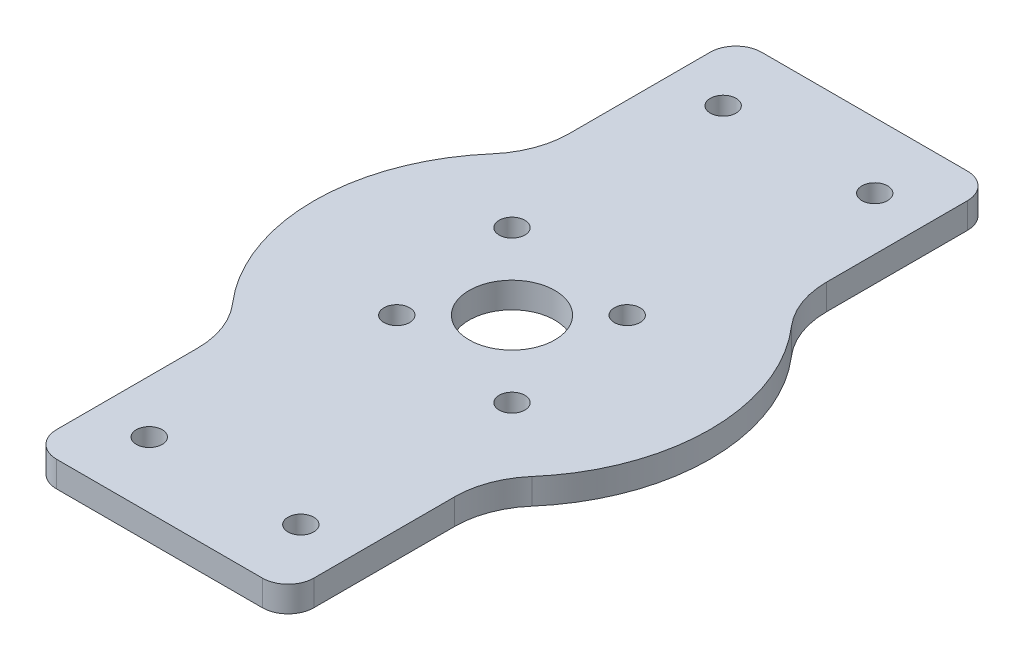
ISO-10303-21;
HEADER;
FILE_DESCRIPTION(('STEP AP214'),'2;1');
FILE_NAME('part.step','',(''),(''),'','','');
FILE_SCHEMA(('AUTOMOTIVE_DESIGN { 1 0 10303 214 1 1 1 1 }'));
ENDSEC;
DATA;
#1=APPLICATION_CONTEXT('core data for automotive mechanical design processes');
#2=APPLICATION_PROTOCOL_DEFINITION('international standard','automotive_design',2000,#1);
#3=PRODUCT_CONTEXT('',#1,'mechanical');
#4=PRODUCT('Part','Part','',(#3));
#5=PRODUCT_RELATED_PRODUCT_CATEGORY('part','',(#4));
#6=PRODUCT_DEFINITION_FORMATION('','',#4);
#7=PRODUCT_DEFINITION_CONTEXT('part definition',#1,'design');
#8=PRODUCT_DEFINITION('design','',#6,#7);
#9=PRODUCT_DEFINITION_SHAPE('','',#8);
#10=(LENGTH_UNIT() NAMED_UNIT(*) SI_UNIT(.MILLI.,.METRE.));
#11=(NAMED_UNIT(*) PLANE_ANGLE_UNIT() SI_UNIT($,.RADIAN.));
#12=(NAMED_UNIT(*) SI_UNIT($,.STERADIAN.) SOLID_ANGLE_UNIT());
#13=UNCERTAINTY_MEASURE_WITH_UNIT(LENGTH_MEASURE(1.E-05),#10,'distance_accuracy_value','');
#14=(GEOMETRIC_REPRESENTATION_CONTEXT(3) GLOBAL_UNCERTAINTY_ASSIGNED_CONTEXT((#13)) GLOBAL_UNIT_ASSIGNED_CONTEXT((#10,
#11,#12)) REPRESENTATION_CONTEXT('',''));
#15=CARTESIAN_POINT('',(0.,0.,0.));
#16=DIRECTION('',(0.,0.,1.));
#17=DIRECTION('',(1.,0.,0.));
#18=AXIS2_PLACEMENT_3D('',#15,#16,#17);
#19=CARTESIAN_POINT('',(25.,3.,21.6935474277491));
#20=DIRECTION('',(0.,-1.,0.));
#21=DIRECTION('',(0.,0.,-1.));
#22=AXIS2_PLACEMENT_3D('',#19,#20,#21);
#23=PLANE('',#22);
#24=CARTESIAN_POINT('',(25.,3.,21.6935474277491));
#25=DIRECTION('',(0.,-1.,0.));
#26=DIRECTION('',(0.,0.,-1.));
#27=AXIS2_PLACEMENT_3D('',#24,#25,#26);
#28=CIRCLE('',#27,10.);
#29=CARTESIAN_POINT('',(15.,3.,21.6935474277491));
#30=VERTEX_POINT('',#29);
#31=CARTESIAN_POINT('',(17.4471299093656,3.,15.1396056066769));
#32=VERTEX_POINT('',#31);
#33=EDGE_CURVE('E208',#30,#32,#28,.T.);
#34=ORIENTED_EDGE('',*,*,#33,.T.);
#35=CARTESIAN_POINT('',(0.,3.,0.));
#36=DIRECTION('',(0.,1.,0.));
#37=DIRECTION('',(0.,0.,-1.));
#38=AXIS2_PLACEMENT_3D('',#35,#36,#37);
#39=CIRCLE('',#38,23.1);
#40=CARTESIAN_POINT('',(17.4471299093656,3.,-15.1396056066769));
#41=VERTEX_POINT('',#40);
#42=EDGE_CURVE('E116',#32,#41,#39,.T.);
#43=ORIENTED_EDGE('',*,*,#42,.T.);
#44=CARTESIAN_POINT('',(25.,3.,-21.6935474277491));
#45=DIRECTION('',(0.,-1.,0.));
#46=DIRECTION('',(0.,0.,1.));
#47=AXIS2_PLACEMENT_3D('',#44,#45,#46);
#48=CIRCLE('',#47,10.);
#49=CARTESIAN_POINT('',(15.,3.,-21.6935474277491));
#50=VERTEX_POINT('',#49);
#51=EDGE_CURVE('E247',#41,#50,#48,.T.);
#52=ORIENTED_EDGE('',*,*,#51,.T.);
#53=DIRECTION('',(0.,0.,-1.));
#54=VECTOR('',#53,1.);
#55=CARTESIAN_POINT('',(15.,3.,-38.1080164681499));
#56=LINE('',#55,#54);
#57=CARTESIAN_POINT('',(15.,3.,-38.1080164681499));
#58=VERTEX_POINT('',#57);
#59=EDGE_CURVE('E266',#50,#58,#56,.T.);
#60=ORIENTED_EDGE('',*,*,#59,.T.);
#61=CARTESIAN_POINT('',(12.,3.,-38.10801646815));
#62=DIRECTION('',(0.,1.,0.));
#63=DIRECTION('',(0.,0.,-1.));
#64=AXIS2_PLACEMENT_3D('',#61,#62,#63);
#65=CIRCLE('',#64,3.);
#66=CARTESIAN_POINT('',(12.,3.,-41.10801646815));
#67=VERTEX_POINT('',#66);
#68=EDGE_CURVE('E263',#58,#67,#65,.T.);
#69=ORIENTED_EDGE('',*,*,#68,.T.);
#70=DIRECTION('',(-1.,0.,0.));
#71=VECTOR('',#70,1.);
#72=CARTESIAN_POINT('',(-12.,3.,-41.10801646815));
#73=LINE('',#72,#71);
#74=CARTESIAN_POINT('',(-12.,3.,-41.10801646815));
#75=VERTEX_POINT('',#74);
#76=EDGE_CURVE('E265',#67,#75,#73,.T.);
#77=ORIENTED_EDGE('',*,*,#76,.T.);
#78=CARTESIAN_POINT('',(-12.,3.,-38.10801646815));
#79=DIRECTION('',(0.,1.,0.));
#80=DIRECTION('',(0.,0.,-1.));
#81=AXIS2_PLACEMENT_3D('',#78,#79,#80);
#82=CIRCLE('',#81,3.);
#83=CARTESIAN_POINT('',(-15.,3.,-38.1080164681499));
#84=VERTEX_POINT('',#83);
#85=EDGE_CURVE('E268',#75,#84,#82,.T.);
#86=ORIENTED_EDGE('',*,*,#85,.T.);
#87=DIRECTION('',(0.,0.,1.));
#88=VECTOR('',#87,1.);
#89=CARTESIAN_POINT('',(-15.,3.,-21.6935474277491));
#90=LINE('',#89,#88);
#91=CARTESIAN_POINT('',(-15.,3.,-21.6935474277491));
#92=VERTEX_POINT('',#91);
#93=EDGE_CURVE('E274',#84,#92,#90,.T.);
#94=ORIENTED_EDGE('',*,*,#93,.T.);
#95=CARTESIAN_POINT('',(-25.,3.,-21.6935474277491));
#96=DIRECTION('',(0.,-1.,0.));
#97=DIRECTION('',(0.,0.,1.));
#98=AXIS2_PLACEMENT_3D('',#95,#96,#97);
#99=CIRCLE('',#98,10.);
#100=CARTESIAN_POINT('',(-17.4471299093656,3.,-15.1396056066769));
#101=VERTEX_POINT('',#100);
#102=EDGE_CURVE('E276',#92,#101,#99,.T.);
#103=ORIENTED_EDGE('',*,*,#102,.T.);
#104=CARTESIAN_POINT('',(0.,3.,0.));
#105=DIRECTION('',(0.,1.,0.));
#106=DIRECTION('',(0.,0.,1.));
#107=AXIS2_PLACEMENT_3D('',#104,#105,#106);
#108=CIRCLE('',#107,23.1);
#109=CARTESIAN_POINT('',(-17.4471299093656,3.,15.1396056066769));
#110=VERTEX_POINT('',#109);
#111=EDGE_CURVE('E278',#101,#110,#108,.T.);
#112=ORIENTED_EDGE('',*,*,#111,.T.);
#113=CARTESIAN_POINT('',(-25.,3.,21.6935474277491));
#114=DIRECTION('',(0.,-1.,0.));
#115=DIRECTION('',(0.,0.,1.));
#116=AXIS2_PLACEMENT_3D('',#113,#114,#115);
#117=CIRCLE('',#116,10.);
#118=CARTESIAN_POINT('',(-15.,3.,21.6935474277491));
#119=VERTEX_POINT('',#118);
#120=EDGE_CURVE('E280',#110,#119,#117,.T.);
#121=ORIENTED_EDGE('',*,*,#120,.T.);
#122=DIRECTION('',(0.,0.,1.));
#123=VECTOR('',#122,1.);
#124=CARTESIAN_POINT('',(-15.,3.,21.6935474277491));
#125=LINE('',#124,#123);
#126=CARTESIAN_POINT('',(-15.,3.,38.1080164681499));
#127=VERTEX_POINT('',#126);
#128=EDGE_CURVE('E282',#119,#127,#125,.T.);
#129=ORIENTED_EDGE('',*,*,#128,.T.);
#130=CARTESIAN_POINT('',(-12.,3.,38.10801646815));
#131=DIRECTION('',(0.,1.,0.));
#132=DIRECTION('',(0.,0.,1.));
#133=AXIS2_PLACEMENT_3D('',#130,#131,#132);
#134=CIRCLE('',#133,3.);
#135=CARTESIAN_POINT('',(-12.,3.,41.10801646815));
#136=VERTEX_POINT('',#135);
#137=EDGE_CURVE('E159',#127,#136,#134,.T.);
#138=ORIENTED_EDGE('',*,*,#137,.T.);
#139=DIRECTION('',(1.,0.,0.));
#140=VECTOR('',#139,1.);
#141=CARTESIAN_POINT('',(-12.,3.,41.10801646815));
#142=LINE('',#141,#140);
#143=CARTESIAN_POINT('',(12.,3.,41.10801646815));
#144=VERTEX_POINT('',#143);
#145=EDGE_CURVE('E153',#136,#144,#142,.T.);
#146=ORIENTED_EDGE('',*,*,#145,.T.);
#147=CARTESIAN_POINT('',(12.,3.,38.10801646815));
#148=DIRECTION('',(0.,1.,0.));
#149=DIRECTION('',(0.,0.,1.));
#150=AXIS2_PLACEMENT_3D('',#147,#148,#149);
#151=CIRCLE('',#150,3.);
#152=CARTESIAN_POINT('',(15.,3.,38.1080164681499));
#153=VERTEX_POINT('',#152);
#154=EDGE_CURVE('E157',#144,#153,#151,.T.);
#155=ORIENTED_EDGE('',*,*,#154,.T.);
#156=DIRECTION('',(0.,0.,-1.));
#157=VECTOR('',#156,1.);
#158=CARTESIAN_POINT('',(15.,3.,38.1080164681499));
#159=LINE('',#158,#157);
#160=EDGE_CURVE('E49',#153,#30,#159,.T.);
#161=ORIENTED_EDGE('',*,*,#160,.T.);
#162=EDGE_LOOP('',(#34,#43,#52,#60,#69,#77,#86,#94,#103,#112,#121,#129,#138,#146,#155,#161));
#163=FACE_BOUND('',#162,.T.);
#164=CARTESIAN_POINT('',(-8.83883476483185,3.,-8.83883476483185));
#165=DIRECTION('',(0.,1.,0.));
#166=DIRECTION('',(0.,0.,1.));
#167=AXIS2_PLACEMENT_3D('',#164,#165,#166);
#168=CIRCLE('',#167,1.5);
#169=CARTESIAN_POINT('',(-8.83883476483185,3.,-7.33883476483185));
#170=VERTEX_POINT('',#169);
#171=EDGE_CURVE('E181',#170,#170,#168,.T.);
#172=ORIENTED_EDGE('',*,*,#171,.F.);
#173=EDGE_LOOP('',(#172));
#174=FACE_BOUND('',#173,.T.);
#175=CARTESIAN_POINT('',(8.83883476483185,3.,8.83883476483184));
#176=DIRECTION('',(0.,1.,0.));
#177=DIRECTION('',(0.,0.,-1.));
#178=AXIS2_PLACEMENT_3D('',#175,#176,#177);
#179=CIRCLE('',#178,1.5);
#180=CARTESIAN_POINT('',(8.83883476483185,3.,7.33883476483184));
#181=VERTEX_POINT('',#180);
#182=EDGE_CURVE('E396',#181,#181,#179,.T.);
#183=ORIENTED_EDGE('',*,*,#182,.F.);
#184=EDGE_LOOP('',(#183));
#185=FACE_BOUND('',#184,.T.);
#186=CARTESIAN_POINT('',(6.7175144212722,3.,-6.7175144212722));
#187=DIRECTION('',(0.,1.,0.));
#188=DIRECTION('',(0.,0.,1.));
#189=AXIS2_PLACEMENT_3D('',#186,#187,#188);
#190=CIRCLE('',#189,1.5);
#191=CARTESIAN_POINT('',(6.7175144212722,3.,-5.2175144212722));
#192=VERTEX_POINT('',#191);
#193=EDGE_CURVE('E390',#192,#192,#190,.T.);
#194=ORIENTED_EDGE('',*,*,#193,.F.);
#195=EDGE_LOOP('',(#194));
#196=FACE_BOUND('',#195,.T.);
#197=CARTESIAN_POINT('',(-6.7175144212722,3.,6.71751442127221));
#198=DIRECTION('',(0.,1.,0.));
#199=DIRECTION('',(0.,0.,-1.));
#200=AXIS2_PLACEMENT_3D('',#197,#198,#199);
#201=CIRCLE('',#200,1.50000000000001);
#202=CARTESIAN_POINT('',(-6.7175144212722,3.,5.2175144212722));
#203=VERTEX_POINT('',#202);
#204=EDGE_CURVE('E384',#203,#203,#201,.T.);
#205=ORIENTED_EDGE('',*,*,#204,.F.);
#206=EDGE_LOOP('',(#205));
#207=FACE_BOUND('',#206,.T.);
#208=CARTESIAN_POINT('',(0.,3.,0.));
#209=DIRECTION('',(0.,1.,0.));
#210=DIRECTION('',(0.,0.,1.));
#211=AXIS2_PLACEMENT_3D('',#208,#209,#210);
#212=CIRCLE('',#211,5.);
#213=CARTESIAN_POINT('',(0.,3.,5.));
#214=VERTEX_POINT('',#213);
#215=EDGE_CURVE('E378',#214,#214,#212,.T.);
#216=ORIENTED_EDGE('',*,*,#215,.F.);
#217=EDGE_LOOP('',(#216));
#218=FACE_BOUND('',#217,.T.);
#219=CARTESIAN_POINT('',(-8.83883476483185,3.,-33.4627924380176));
#220=DIRECTION('',(0.,1.,0.));
#221=DIRECTION('',(0.,0.,1.));
#222=AXIS2_PLACEMENT_3D('',#219,#220,#221);
#223=CIRCLE('',#222,1.5);
#224=CARTESIAN_POINT('',(-8.83883476483185,3.,-31.9627924380176));
#225=VERTEX_POINT('',#224);
#226=EDGE_CURVE('E372',#225,#225,#223,.T.);
#227=ORIENTED_EDGE('',*,*,#226,.F.);
#228=EDGE_LOOP('',(#227));
#229=FACE_BOUND('',#228,.T.);
#230=CARTESIAN_POINT('',(8.83883476483185,3.,-33.4627924380176));
#231=DIRECTION('',(0.,1.,0.));
#232=DIRECTION('',(0.,0.,-1.));
#233=AXIS2_PLACEMENT_3D('',#230,#231,#232);
#234=CIRCLE('',#233,1.5);
#235=CARTESIAN_POINT('',(8.83883476483185,3.,-34.9627924380176));
#236=VERTEX_POINT('',#235);
#237=EDGE_CURVE('E366',#236,#236,#234,.T.);
#238=ORIENTED_EDGE('',*,*,#237,.F.);
#239=EDGE_LOOP('',(#238));
#240=FACE_BOUND('',#239,.T.);
#241=CARTESIAN_POINT('',(8.83883476483185,3.,33.4627924380176));
#242=DIRECTION('',(0.,1.,0.));
#243=DIRECTION('',(0.,0.,1.));
#244=AXIS2_PLACEMENT_3D('',#241,#242,#243);
#245=CIRCLE('',#244,1.5);
#246=CARTESIAN_POINT('',(8.83883476483185,3.,34.9627924380176));
#247=VERTEX_POINT('',#246);
#248=EDGE_CURVE('E360',#247,#247,#245,.T.);
#249=ORIENTED_EDGE('',*,*,#248,.F.);
#250=EDGE_LOOP('',(#249));
#251=FACE_BOUND('',#250,.T.);
#252=CARTESIAN_POINT('',(-8.83883476483185,3.,33.4627924380176));
#253=DIRECTION('',(0.,1.,0.));
#254=DIRECTION('',(0.,0.,-1.));
#255=AXIS2_PLACEMENT_3D('',#252,#253,#254);
#256=CIRCLE('',#255,1.5);
#257=CARTESIAN_POINT('',(-8.83883476483185,3.,31.9627924380176));
#258=VERTEX_POINT('',#257);
#259=EDGE_CURVE('E351',#258,#258,#256,.T.);
#260=ORIENTED_EDGE('',*,*,#259,.F.);
#261=EDGE_LOOP('',(#260));
#262=FACE_BOUND('',#261,.T.);
#263=ADVANCED_FACE('F32',(#163,#174,#185,#196,#207,#218,#229,#240,#251,#262),#23,.F.);
#264=CARTESIAN_POINT('',(25.,0.,21.6935474277491));
#265=DIRECTION('',(0.,-1.,0.));
#266=DIRECTION('',(0.,0.,-1.));
#267=AXIS2_PLACEMENT_3D('',#264,#265,#266);
#268=PLANE('',#267);
#269=CARTESIAN_POINT('',(8.83883476483185,0.,33.4627924380176));
#270=DIRECTION('',(0.,1.,0.));
#271=DIRECTION('',(0.,0.,1.));
#272=AXIS2_PLACEMENT_3D('',#269,#270,#271);
#273=CIRCLE('',#272,1.5);
#274=CARTESIAN_POINT('',(8.83883476483185,0.,34.9627924380176));
#275=VERTEX_POINT('',#274);
#276=EDGE_CURVE('E357',#275,#275,#273,.T.);
#277=ORIENTED_EDGE('',*,*,#276,.T.);
#278=EDGE_LOOP('',(#277));
#279=FACE_BOUND('',#278,.T.);
#280=CARTESIAN_POINT('',(-8.83883476483185,0.,-33.4627924380176));
#281=DIRECTION('',(0.,1.,0.));
#282=DIRECTION('',(0.,0.,1.));
#283=AXIS2_PLACEMENT_3D('',#280,#281,#282);
#284=CIRCLE('',#283,1.5);
#285=CARTESIAN_POINT('',(-8.83883476483185,0.,-31.9627924380176));
#286=VERTEX_POINT('',#285);
#287=EDGE_CURVE('E369',#286,#286,#284,.T.);
#288=ORIENTED_EDGE('',*,*,#287,.T.);
#289=EDGE_LOOP('',(#288));
#290=FACE_BOUND('',#289,.T.);
#291=CARTESIAN_POINT('',(-6.7175144212722,0.,6.71751442127221));
#292=DIRECTION('',(0.,1.,0.));
#293=DIRECTION('',(0.,0.,-1.));
#294=AXIS2_PLACEMENT_3D('',#291,#292,#293);
#295=CIRCLE('',#294,1.50000000000001);
#296=CARTESIAN_POINT('',(-6.7175144212722,0.,5.2175144212722));
#297=VERTEX_POINT('',#296);
#298=EDGE_CURVE('E381',#297,#297,#295,.T.);
#299=ORIENTED_EDGE('',*,*,#298,.T.);
#300=EDGE_LOOP('',(#299));
#301=FACE_BOUND('',#300,.T.);
#302=CARTESIAN_POINT('',(8.83883476483185,0.,8.83883476483184));
#303=DIRECTION('',(0.,1.,0.));
#304=DIRECTION('',(0.,0.,-1.));
#305=AXIS2_PLACEMENT_3D('',#302,#303,#304);
#306=CIRCLE('',#305,1.5);
#307=CARTESIAN_POINT('',(8.83883476483185,0.,7.33883476483184));
#308=VERTEX_POINT('',#307);
#309=EDGE_CURVE('E393',#308,#308,#306,.T.);
#310=ORIENTED_EDGE('',*,*,#309,.T.);
#311=EDGE_LOOP('',(#310));
#312=FACE_BOUND('',#311,.T.);
#313=CARTESIAN_POINT('',(25.,0.,21.6935474277491));
#314=DIRECTION('',(0.,-1.,0.));
#315=DIRECTION('',(0.,0.,-1.));
#316=AXIS2_PLACEMENT_3D('',#313,#314,#315);
#317=CIRCLE('',#316,10.);
#318=CARTESIAN_POINT('',(15.,0.,21.6935474277491));
#319=VERTEX_POINT('',#318);
#320=CARTESIAN_POINT('',(17.4471299093656,0.,15.1396056066769));
#321=VERTEX_POINT('',#320);
#322=EDGE_CURVE('E177',#319,#321,#317,.T.);
#323=ORIENTED_EDGE('',*,*,#322,.F.);
#324=DIRECTION('',(0.,0.,-1.));
#325=VECTOR('',#324,1.);
#326=CARTESIAN_POINT('',(15.,0.,38.1080164681499));
#327=LINE('',#326,#325);
#328=CARTESIAN_POINT('',(15.,0.,38.1080164681499));
#329=VERTEX_POINT('',#328);
#330=EDGE_CURVE('E108',#329,#319,#327,.T.);
#331=ORIENTED_EDGE('',*,*,#330,.F.);
#332=CARTESIAN_POINT('',(12.,0.,38.10801646815));
#333=DIRECTION('',(0.,1.,0.));
#334=DIRECTION('',(0.,0.,1.));
#335=AXIS2_PLACEMENT_3D('',#332,#333,#334);
#336=CIRCLE('',#335,3.);
#337=CARTESIAN_POINT('',(12.,0.,41.10801646815));
#338=VERTEX_POINT('',#337);
#339=EDGE_CURVE('E102',#338,#329,#336,.T.);
#340=ORIENTED_EDGE('',*,*,#339,.F.);
#341=DIRECTION('',(1.,0.,0.));
#342=VECTOR('',#341,1.);
#343=CARTESIAN_POINT('',(-12.,0.,41.10801646815));
#344=LINE('',#343,#342);
#345=CARTESIAN_POINT('',(-12.,0.,41.10801646815));
#346=VERTEX_POINT('',#345);
#347=EDGE_CURVE('E167',#346,#338,#344,.T.);
#348=ORIENTED_EDGE('',*,*,#347,.F.);
#349=CARTESIAN_POINT('',(-12.,0.,38.10801646815));
#350=DIRECTION('',(0.,1.,0.));
#351=DIRECTION('',(0.,0.,1.));
#352=AXIS2_PLACEMENT_3D('',#349,#350,#351);
#353=CIRCLE('',#352,3.);
#354=CARTESIAN_POINT('',(-15.,0.,38.1080164681499));
#355=VERTEX_POINT('',#354);
#356=EDGE_CURVE('E203',#355,#346,#353,.T.);
#357=ORIENTED_EDGE('',*,*,#356,.F.);
#358=DIRECTION('',(0.,0.,1.));
#359=VECTOR('',#358,1.);
#360=CARTESIAN_POINT('',(-15.,0.,21.6935474277491));
#361=LINE('',#360,#359);
#362=CARTESIAN_POINT('',(-15.,0.,21.6935474277491));
#363=VERTEX_POINT('',#362);
#364=EDGE_CURVE('E201',#363,#355,#361,.T.);
#365=ORIENTED_EDGE('',*,*,#364,.F.);
#366=CARTESIAN_POINT('',(-25.,0.,21.6935474277491));
#367=DIRECTION('',(0.,-1.,0.));
#368=DIRECTION('',(0.,0.,1.));
#369=AXIS2_PLACEMENT_3D('',#366,#367,#368);
#370=CIRCLE('',#369,10.);
#371=CARTESIAN_POINT('',(-17.4471299093656,0.,15.1396056066769));
#372=VERTEX_POINT('',#371);
#373=EDGE_CURVE('E199',#372,#363,#370,.T.);
#374=ORIENTED_EDGE('',*,*,#373,.F.);
#375=CARTESIAN_POINT('',(0.,0.,0.));
#376=DIRECTION('',(0.,1.,0.));
#377=DIRECTION('',(0.,0.,1.));
#378=AXIS2_PLACEMENT_3D('',#375,#376,#377);
#379=CIRCLE('',#378,23.1);
#380=CARTESIAN_POINT('',(-17.4471299093656,0.,-15.1396056066769));
#381=VERTEX_POINT('',#380);
#382=EDGE_CURVE('E197',#381,#372,#379,.T.);
#383=ORIENTED_EDGE('',*,*,#382,.F.);
#384=CARTESIAN_POINT('',(-25.,0.,-21.6935474277491));
#385=DIRECTION('',(0.,-1.,0.));
#386=DIRECTION('',(0.,0.,1.));
#387=AXIS2_PLACEMENT_3D('',#384,#385,#386);
#388=CIRCLE('',#387,10.);
#389=CARTESIAN_POINT('',(-15.,0.,-21.6935474277491));
#390=VERTEX_POINT('',#389);
#391=EDGE_CURVE('E195',#390,#381,#388,.T.);
#392=ORIENTED_EDGE('',*,*,#391,.F.);
#393=DIRECTION('',(0.,0.,1.));
#394=VECTOR('',#393,1.);
#395=CARTESIAN_POINT('',(-15.,0.,-21.6935474277491));
#396=LINE('',#395,#394);
#397=CARTESIAN_POINT('',(-15.,0.,-38.1080164681499));
#398=VERTEX_POINT('',#397);
#399=EDGE_CURVE('E193',#398,#390,#396,.T.);
#400=ORIENTED_EDGE('',*,*,#399,.F.);
#401=CARTESIAN_POINT('',(-12.,0.,-38.10801646815));
#402=DIRECTION('',(0.,1.,0.));
#403=DIRECTION('',(0.,0.,-1.));
#404=AXIS2_PLACEMENT_3D('',#401,#402,#403);
#405=CIRCLE('',#404,3.);
#406=CARTESIAN_POINT('',(-12.,0.,-41.10801646815));
#407=VERTEX_POINT('',#406);
#408=EDGE_CURVE('E191',#407,#398,#405,.T.);
#409=ORIENTED_EDGE('',*,*,#408,.F.);
#410=DIRECTION('',(-1.,0.,0.));
#411=VECTOR('',#410,1.);
#412=CARTESIAN_POINT('',(-12.,0.,-41.10801646815));
#413=LINE('',#412,#411);
#414=CARTESIAN_POINT('',(12.,0.,-41.10801646815));
#415=VERTEX_POINT('',#414);
#416=EDGE_CURVE('E189',#415,#407,#413,.T.);
#417=ORIENTED_EDGE('',*,*,#416,.F.);
#418=CARTESIAN_POINT('',(12.,0.,-38.10801646815));
#419=DIRECTION('',(0.,1.,0.));
#420=DIRECTION('',(0.,0.,-1.));
#421=AXIS2_PLACEMENT_3D('',#418,#419,#420);
#422=CIRCLE('',#421,3.);
#423=CARTESIAN_POINT('',(15.,0.,-38.1080164681499));
#424=VERTEX_POINT('',#423);
#425=EDGE_CURVE('E187',#424,#415,#422,.T.);
#426=ORIENTED_EDGE('',*,*,#425,.F.);
#427=DIRECTION('',(0.,0.,-1.));
#428=VECTOR('',#427,1.);
#429=CARTESIAN_POINT('',(15.,0.,-38.1080164681499));
#430=LINE('',#429,#428);
#431=CARTESIAN_POINT('',(15.,0.,-21.6935474277491));
#432=VERTEX_POINT('',#431);
#433=EDGE_CURVE('E185',#432,#424,#430,.T.);
#434=ORIENTED_EDGE('',*,*,#433,.F.);
#435=CARTESIAN_POINT('',(25.,0.,-21.6935474277491));
#436=DIRECTION('',(0.,-1.,0.));
#437=DIRECTION('',(0.,0.,1.));
#438=AXIS2_PLACEMENT_3D('',#435,#436,#437);
#439=CIRCLE('',#438,10.);
#440=CARTESIAN_POINT('',(17.4471299093656,0.,-15.1396056066769));
#441=VERTEX_POINT('',#440);
#442=EDGE_CURVE('E183',#441,#432,#439,.T.);
#443=ORIENTED_EDGE('',*,*,#442,.F.);
#444=CARTESIAN_POINT('',(0.,0.,0.));
#445=DIRECTION('',(0.,1.,0.));
#446=DIRECTION('',(0.,0.,-1.));
#447=AXIS2_PLACEMENT_3D('',#444,#445,#446);
#448=CIRCLE('',#447,23.1);
#449=EDGE_CURVE('E180',#321,#441,#448,.T.);
#450=ORIENTED_EDGE('',*,*,#449,.F.);
#451=EDGE_LOOP('',(#323,#331,#340,#348,#357,#365,#374,#383,#392,#400,#409,#417,#426,#434,#443,#450));
#452=FACE_BOUND('',#451,.T.);
#453=CARTESIAN_POINT('',(-8.83883476483185,0.,-8.83883476483185));
#454=DIRECTION('',(0.,1.,0.));
#455=DIRECTION('',(0.,0.,1.));
#456=AXIS2_PLACEMENT_3D('',#453,#454,#455);
#457=CIRCLE('',#456,1.5);
#458=CARTESIAN_POINT('',(-8.83883476483185,0.,-7.33883476483185));
#459=VERTEX_POINT('',#458);
#460=EDGE_CURVE('E399',#459,#459,#457,.T.);
#461=ORIENTED_EDGE('',*,*,#460,.T.);
#462=EDGE_LOOP('',(#461));
#463=FACE_BOUND('',#462,.T.);
#464=CARTESIAN_POINT('',(6.7175144212722,0.,-6.7175144212722));
#465=DIRECTION('',(0.,1.,0.));
#466=DIRECTION('',(0.,0.,1.));
#467=AXIS2_PLACEMENT_3D('',#464,#465,#466);
#468=CIRCLE('',#467,1.5);
#469=CARTESIAN_POINT('',(6.7175144212722,0.,-5.2175144212722));
#470=VERTEX_POINT('',#469);
#471=EDGE_CURVE('E387',#470,#470,#468,.T.);
#472=ORIENTED_EDGE('',*,*,#471,.T.);
#473=EDGE_LOOP('',(#472));
#474=FACE_BOUND('',#473,.T.);
#475=CARTESIAN_POINT('',(0.,0.,0.));
#476=DIRECTION('',(0.,1.,0.));
#477=DIRECTION('',(0.,0.,1.));
#478=AXIS2_PLACEMENT_3D('',#475,#476,#477);
#479=CIRCLE('',#478,5.);
#480=CARTESIAN_POINT('',(0.,0.,5.));
#481=VERTEX_POINT('',#480);
#482=EDGE_CURVE('E375',#481,#481,#479,.T.);
#483=ORIENTED_EDGE('',*,*,#482,.T.);
#484=EDGE_LOOP('',(#483));
#485=FACE_BOUND('',#484,.T.);
#486=CARTESIAN_POINT('',(8.83883476483185,0.,-33.4627924380176));
#487=DIRECTION('',(0.,1.,0.));
#488=DIRECTION('',(0.,0.,-1.));
#489=AXIS2_PLACEMENT_3D('',#486,#487,#488);
#490=CIRCLE('',#489,1.5);
#491=CARTESIAN_POINT('',(8.83883476483185,0.,-34.9627924380176));
#492=VERTEX_POINT('',#491);
#493=EDGE_CURVE('E363',#492,#492,#490,.T.);
#494=ORIENTED_EDGE('',*,*,#493,.T.);
#495=EDGE_LOOP('',(#494));
#496=FACE_BOUND('',#495,.T.);
#497=CARTESIAN_POINT('',(-8.83883476483185,0.,33.4627924380176));
#498=DIRECTION('',(0.,1.,0.));
#499=DIRECTION('',(0.,0.,-1.));
#500=AXIS2_PLACEMENT_3D('',#497,#498,#499);
#501=CIRCLE('',#500,1.5);
#502=CARTESIAN_POINT('',(-8.83883476483185,0.,31.9627924380176));
#503=VERTEX_POINT('',#502);
#504=EDGE_CURVE('E354',#503,#503,#501,.T.);
#505=ORIENTED_EDGE('',*,*,#504,.T.);
#506=EDGE_LOOP('',(#505));
#507=FACE_BOUND('',#506,.T.);
#508=ADVANCED_FACE('F251',(#279,#290,#301,#312,#452,#463,#474,#485,#496,#507),#268,.T.);
#509=CARTESIAN_POINT('',(25.,3.,21.6935474277491));
#510=DIRECTION('',(0.,-1.,0.));
#511=DIRECTION('',(0.,0.,-1.));
#512=AXIS2_PLACEMENT_3D('',#509,#510,#511);
#513=CYLINDRICAL_SURFACE('',#512,10.);
#514=ORIENTED_EDGE('',*,*,#322,.T.);
#515=DIRECTION('',(0.,-1.,0.));
#516=VECTOR('',#515,1.);
#517=CARTESIAN_POINT('',(17.4471299093656,3.,15.1396056066769));
#518=LINE('',#517,#516);
#519=EDGE_CURVE('E11',#32,#321,#518,.T.);
#520=ORIENTED_EDGE('',*,*,#519,.F.);
#521=ORIENTED_EDGE('',*,*,#33,.F.);
#522=DIRECTION('',(0.,-1.,0.));
#523=VECTOR('',#522,1.);
#524=CARTESIAN_POINT('',(15.,3.,21.6935474277491));
#525=LINE('',#524,#523);
#526=EDGE_CURVE('E173',#30,#319,#525,.T.);
#527=ORIENTED_EDGE('',*,*,#526,.T.);
#528=EDGE_LOOP('',(#514,#520,#521,#527));
#529=FACE_BOUND('',#528,.T.);
#530=ADVANCED_FACE('F34',(#529),#513,.F.);
#531=CARTESIAN_POINT('',(0.,3.,0.));
#532=DIRECTION('',(0.,-1.,0.));
#533=DIRECTION('',(0.,0.,-1.));
#534=AXIS2_PLACEMENT_3D('',#531,#532,#533);
#535=CYLINDRICAL_SURFACE('',#534,23.1);
#536=ORIENTED_EDGE('',*,*,#449,.T.);
#537=DIRECTION('',(0.,-1.,0.));
#538=VECTOR('',#537,1.);
#539=CARTESIAN_POINT('',(17.4471299093656,3.,-15.1396056066769));
#540=LINE('',#539,#538);
#541=EDGE_CURVE('E41',#41,#441,#540,.T.);
#542=ORIENTED_EDGE('',*,*,#541,.F.);
#543=ORIENTED_EDGE('',*,*,#42,.F.);
#544=ORIENTED_EDGE('',*,*,#519,.T.);
#545=EDGE_LOOP('',(#536,#542,#543,#544));
#546=FACE_BOUND('',#545,.T.);
#547=ADVANCED_FACE('F596',(#546),#535,.T.);
#548=CARTESIAN_POINT('',(25.,3.,-21.6935474277491));
#549=DIRECTION('',(0.,-1.,0.));
#550=DIRECTION('',(0.,0.,-1.));
#551=AXIS2_PLACEMENT_3D('',#548,#549,#550);
#552=CYLINDRICAL_SURFACE('',#551,10.);
#553=ORIENTED_EDGE('',*,*,#442,.T.);
#554=DIRECTION('',(0.,-1.,0.));
#555=VECTOR('',#554,1.);
#556=CARTESIAN_POINT('',(15.,3.,-21.6935474277491));
#557=LINE('',#556,#555);
#558=EDGE_CURVE('E239',#50,#432,#557,.T.);
#559=ORIENTED_EDGE('',*,*,#558,.F.);
#560=ORIENTED_EDGE('',*,*,#51,.F.);
#561=ORIENTED_EDGE('',*,*,#541,.T.);
#562=EDGE_LOOP('',(#553,#559,#560,#561));
#563=FACE_BOUND('',#562,.T.);
#564=ADVANCED_FACE('F245',(#563),#552,.F.);
#565=CARTESIAN_POINT('',(15.,3.,-38.1080164681499));
#566=DIRECTION('',(-1.,0.,0.));
#567=DIRECTION('',(0.,0.,1.));
#568=AXIS2_PLACEMENT_3D('',#565,#566,#567);
#569=PLANE('',#568);
#570=ORIENTED_EDGE('',*,*,#433,.T.);
#571=DIRECTION('',(0.,-1.,0.));
#572=VECTOR('',#571,1.);
#573=CARTESIAN_POINT('',(15.,3.,-38.1080164681499));
#574=LINE('',#573,#572);
#575=EDGE_CURVE('E236',#58,#424,#574,.T.);
#576=ORIENTED_EDGE('',*,*,#575,.F.);
#577=ORIENTED_EDGE('',*,*,#59,.F.);
#578=ORIENTED_EDGE('',*,*,#558,.T.);
#579=EDGE_LOOP('',(#570,#576,#577,#578));
#580=FACE_BOUND('',#579,.T.);
#581=ADVANCED_FACE('F257',(#580),#569,.F.);
#582=CARTESIAN_POINT('',(12.,3.,-38.10801646815));
#583=DIRECTION('',(0.,-1.,0.));
#584=DIRECTION('',(0.,0.,-1.));
#585=AXIS2_PLACEMENT_3D('',#582,#583,#584);
#586=CYLINDRICAL_SURFACE('',#585,3.);
#587=ORIENTED_EDGE('',*,*,#425,.T.);
#588=DIRECTION('',(0.,-1.,0.));
#589=VECTOR('',#588,1.);
#590=CARTESIAN_POINT('',(12.,3.,-41.10801646815));
#591=LINE('',#590,#589);
#592=EDGE_CURVE('E233',#67,#415,#591,.T.);
#593=ORIENTED_EDGE('',*,*,#592,.F.);
#594=ORIENTED_EDGE('',*,*,#68,.F.);
#595=ORIENTED_EDGE('',*,*,#575,.T.);
#596=EDGE_LOOP('',(#587,#593,#594,#595));
#597=FACE_BOUND('',#596,.T.);
#598=ADVANCED_FACE('F261',(#597),#586,.T.);
#599=CARTESIAN_POINT('',(-12.,3.,-41.10801646815));
#600=DIRECTION('',(0.,0.,1.));
#601=DIRECTION('',(1.,0.,0.));
#602=AXIS2_PLACEMENT_3D('',#599,#600,#601);
#603=PLANE('',#602);
#604=ORIENTED_EDGE('',*,*,#416,.T.);
#605=DIRECTION('',(0.,-1.,0.));
#606=VECTOR('',#605,1.);
#607=CARTESIAN_POINT('',(-12.,3.,-41.10801646815));
#608=LINE('',#607,#606);
#609=EDGE_CURVE('E230',#75,#407,#608,.T.);
#610=ORIENTED_EDGE('',*,*,#609,.F.);
#611=ORIENTED_EDGE('',*,*,#76,.F.);
#612=ORIENTED_EDGE('',*,*,#592,.T.);
#613=EDGE_LOOP('',(#604,#610,#611,#612));
#614=FACE_BOUND('',#613,.T.);
#615=ADVANCED_FACE('F561',(#614),#603,.F.);
#616=CARTESIAN_POINT('',(-12.,3.,-38.10801646815));
#617=DIRECTION('',(0.,-1.,0.));
#618=DIRECTION('',(0.,0.,-1.));
#619=AXIS2_PLACEMENT_3D('',#616,#617,#618);
#620=CYLINDRICAL_SURFACE('',#619,3.);
#621=ORIENTED_EDGE('',*,*,#408,.T.);
#622=DIRECTION('',(0.,-1.,0.));
#623=VECTOR('',#622,1.);
#624=CARTESIAN_POINT('',(-15.,3.,-38.1080164681499));
#625=LINE('',#624,#623);
#626=EDGE_CURVE('E227',#84,#398,#625,.T.);
#627=ORIENTED_EDGE('',*,*,#626,.F.);
#628=ORIENTED_EDGE('',*,*,#85,.F.);
#629=ORIENTED_EDGE('',*,*,#609,.T.);
#630=EDGE_LOOP('',(#621,#627,#628,#629));
#631=FACE_BOUND('',#630,.T.);
#632=ADVANCED_FACE('F551',(#631),#620,.T.);
#633=CARTESIAN_POINT('',(-15.,3.,-21.6935474277491));
#634=DIRECTION('',(1.,0.,0.));
#635=DIRECTION('',(0.,0.,-1.));
#636=AXIS2_PLACEMENT_3D('',#633,#634,#635);
#637=PLANE('',#636);
#638=ORIENTED_EDGE('',*,*,#399,.T.);
#639=DIRECTION('',(0.,-1.,0.));
#640=VECTOR('',#639,1.);
#641=CARTESIAN_POINT('',(-15.,3.,-21.6935474277491));
#642=LINE('',#641,#640);
#643=EDGE_CURVE('E224',#92,#390,#642,.T.);
#644=ORIENTED_EDGE('',*,*,#643,.F.);
#645=ORIENTED_EDGE('',*,*,#93,.F.);
#646=ORIENTED_EDGE('',*,*,#626,.T.);
#647=EDGE_LOOP('',(#638,#644,#645,#646));
#648=FACE_BOUND('',#647,.T.);
#649=ADVANCED_FACE('F541',(#648),#637,.F.);
#650=CARTESIAN_POINT('',(-25.,3.,-21.6935474277491));
#651=DIRECTION('',(0.,-1.,0.));
#652=DIRECTION('',(0.,0.,-1.));
#653=AXIS2_PLACEMENT_3D('',#650,#651,#652);
#654=CYLINDRICAL_SURFACE('',#653,10.);
#655=ORIENTED_EDGE('',*,*,#391,.T.);
#656=DIRECTION('',(0.,-1.,0.));
#657=VECTOR('',#656,1.);
#658=CARTESIAN_POINT('',(-17.4471299093656,3.,-15.1396056066769));
#659=LINE('',#658,#657);
#660=EDGE_CURVE('E221',#101,#381,#659,.T.);
#661=ORIENTED_EDGE('',*,*,#660,.F.);
#662=ORIENTED_EDGE('',*,*,#102,.F.);
#663=ORIENTED_EDGE('',*,*,#643,.T.);
#664=EDGE_LOOP('',(#655,#661,#662,#663));
#665=FACE_BOUND('',#664,.T.);
#666=ADVANCED_FACE('F531',(#665),#654,.F.);
#667=CARTESIAN_POINT('',(0.,3.,0.));
#668=DIRECTION('',(0.,-1.,0.));
#669=DIRECTION('',(0.,0.,-1.));
#670=AXIS2_PLACEMENT_3D('',#667,#668,#669);
#671=CYLINDRICAL_SURFACE('',#670,23.1);
#672=ORIENTED_EDGE('',*,*,#382,.T.);
#673=DIRECTION('',(0.,-1.,0.));
#674=VECTOR('',#673,1.);
#675=CARTESIAN_POINT('',(-17.4471299093656,3.,15.1396056066769));
#676=LINE('',#675,#674);
#677=EDGE_CURVE('E218',#110,#372,#676,.T.);
#678=ORIENTED_EDGE('',*,*,#677,.F.);
#679=ORIENTED_EDGE('',*,*,#111,.F.);
#680=ORIENTED_EDGE('',*,*,#660,.T.);
#681=EDGE_LOOP('',(#672,#678,#679,#680));
#682=FACE_BOUND('',#681,.T.);
#683=ADVANCED_FACE('F521',(#682),#671,.T.);
#684=CARTESIAN_POINT('',(-25.,3.,21.6935474277491));
#685=DIRECTION('',(0.,-1.,0.));
#686=DIRECTION('',(0.,0.,-1.));
#687=AXIS2_PLACEMENT_3D('',#684,#685,#686);
#688=CYLINDRICAL_SURFACE('',#687,10.);
#689=ORIENTED_EDGE('',*,*,#373,.T.);
#690=DIRECTION('',(0.,-1.,0.));
#691=VECTOR('',#690,1.);
#692=CARTESIAN_POINT('',(-15.,3.,21.6935474277491));
#693=LINE('',#692,#691);
#694=EDGE_CURVE('E215',#119,#363,#693,.T.);
#695=ORIENTED_EDGE('',*,*,#694,.F.);
#696=ORIENTED_EDGE('',*,*,#120,.F.);
#697=ORIENTED_EDGE('',*,*,#677,.T.);
#698=EDGE_LOOP('',(#689,#695,#696,#697));
#699=FACE_BOUND('',#698,.T.);
#700=ADVANCED_FACE('F512',(#699),#688,.F.);
#701=CARTESIAN_POINT('',(-15.,3.,21.6935474277491));
#702=DIRECTION('',(1.,0.,0.));
#703=DIRECTION('',(0.,0.,-1.));
#704=AXIS2_PLACEMENT_3D('',#701,#702,#703);
#705=PLANE('',#704);
#706=ORIENTED_EDGE('',*,*,#364,.T.);
#707=DIRECTION('',(0.,-1.,0.));
#708=VECTOR('',#707,1.);
#709=CARTESIAN_POINT('',(-15.,3.,38.1080164681499));
#710=LINE('',#709,#708);
#711=EDGE_CURVE('E212',#127,#355,#710,.T.);
#712=ORIENTED_EDGE('',*,*,#711,.F.);
#713=ORIENTED_EDGE('',*,*,#128,.F.);
#714=ORIENTED_EDGE('',*,*,#694,.T.);
#715=EDGE_LOOP('',(#706,#712,#713,#714));
#716=FACE_BOUND('',#715,.T.);
#717=ADVANCED_FACE('F288',(#716),#705,.F.);
#718=CARTESIAN_POINT('',(-12.,3.,38.10801646815));
#719=DIRECTION('',(0.,-1.,0.));
#720=DIRECTION('',(0.,0.,-1.));
#721=AXIS2_PLACEMENT_3D('',#718,#719,#720);
#722=CYLINDRICAL_SURFACE('',#721,3.);
#723=ORIENTED_EDGE('',*,*,#356,.T.);
#724=DIRECTION('',(0.,-1.,0.));
#725=VECTOR('',#724,1.);
#726=CARTESIAN_POINT('',(-12.,3.,41.10801646815));
#727=LINE('',#726,#725);
#728=EDGE_CURVE('E168',#136,#346,#727,.T.);
#729=ORIENTED_EDGE('',*,*,#728,.F.);
#730=ORIENTED_EDGE('',*,*,#137,.F.);
#731=ORIENTED_EDGE('',*,*,#711,.T.);
#732=EDGE_LOOP('',(#723,#729,#730,#731));
#733=FACE_BOUND('',#732,.T.);
#734=ADVANCED_FACE('F292',(#733),#722,.T.);
#735=CARTESIAN_POINT('',(-12.,3.,41.10801646815));
#736=DIRECTION('',(0.,0.,-1.));
#737=DIRECTION('',(-1.,0.,0.));
#738=AXIS2_PLACEMENT_3D('',#735,#736,#737);
#739=PLANE('',#738);
#740=ORIENTED_EDGE('',*,*,#347,.T.);
#741=DIRECTION('',(0.,-1.,0.));
#742=VECTOR('',#741,1.);
#743=CARTESIAN_POINT('',(12.,3.,41.10801646815));
#744=LINE('',#743,#742);
#745=EDGE_CURVE('E164',#144,#338,#744,.T.);
#746=ORIENTED_EDGE('',*,*,#745,.F.);
#747=ORIENTED_EDGE('',*,*,#145,.F.);
#748=ORIENTED_EDGE('',*,*,#728,.T.);
#749=EDGE_LOOP('',(#740,#746,#747,#748));
#750=FACE_BOUND('',#749,.T.);
#751=ADVANCED_FACE('F165',(#750),#739,.F.);
#752=CARTESIAN_POINT('',(12.,3.,38.10801646815));
#753=DIRECTION('',(0.,-1.,0.));
#754=DIRECTION('',(0.,0.,-1.));
#755=AXIS2_PLACEMENT_3D('',#752,#753,#754);
#756=CYLINDRICAL_SURFACE('',#755,3.);
#757=ORIENTED_EDGE('',*,*,#339,.T.);
#758=DIRECTION('',(0.,-1.,0.));
#759=VECTOR('',#758,1.);
#760=CARTESIAN_POINT('',(15.,3.,38.1080164681499));
#761=LINE('',#760,#759);
#762=EDGE_CURVE('E169',#153,#329,#761,.T.);
#763=ORIENTED_EDGE('',*,*,#762,.F.);
#764=ORIENTED_EDGE('',*,*,#154,.F.);
#765=ORIENTED_EDGE('',*,*,#745,.T.);
#766=EDGE_LOOP('',(#757,#763,#764,#765));
#767=FACE_BOUND('',#766,.T.);
#768=ADVANCED_FACE('F171',(#767),#756,.T.);
#769=CARTESIAN_POINT('',(15.,3.,38.1080164681499));
#770=DIRECTION('',(-1.,0.,0.));
#771=DIRECTION('',(0.,0.,1.));
#772=AXIS2_PLACEMENT_3D('',#769,#770,#771);
#773=PLANE('',#772);
#774=ORIENTED_EDGE('',*,*,#330,.T.);
#775=ORIENTED_EDGE('',*,*,#526,.F.);
#776=ORIENTED_EDGE('',*,*,#160,.F.);
#777=ORIENTED_EDGE('',*,*,#762,.T.);
#778=EDGE_LOOP('',(#774,#775,#776,#777));
#779=FACE_BOUND('',#778,.T.);
#780=ADVANCED_FACE('F296',(#779),#773,.F.);
#781=CARTESIAN_POINT('',(-8.83883476483185,3.,-8.83883476483185));
#782=DIRECTION('',(0.,-1.,0.));
#783=DIRECTION('',(0.,0.,-1.));
#784=AXIS2_PLACEMENT_3D('',#781,#782,#783);
#785=CYLINDRICAL_SURFACE('',#784,1.5);
#786=ORIENTED_EDGE('',*,*,#171,.T.);
#787=EDGE_LOOP('',(#786));
#788=FACE_BOUND('',#787,.T.);
#789=ORIENTED_EDGE('',*,*,#460,.F.);
#790=EDGE_LOOP('',(#789));
#791=FACE_BOUND('',#790,.T.);
#792=ADVANCED_FACE('F298',(#788,#791),#785,.F.);
#793=CARTESIAN_POINT('',(8.83883476483185,3.,8.83883476483184));
#794=DIRECTION('',(0.,-1.,0.));
#795=DIRECTION('',(0.,0.,-1.));
#796=AXIS2_PLACEMENT_3D('',#793,#794,#795);
#797=CYLINDRICAL_SURFACE('',#796,1.5);
#798=ORIENTED_EDGE('',*,*,#182,.T.);
#799=EDGE_LOOP('',(#798));
#800=FACE_BOUND('',#799,.T.);
#801=ORIENTED_EDGE('',*,*,#309,.F.);
#802=EDGE_LOOP('',(#801));
#803=FACE_BOUND('',#802,.T.);
#804=ADVANCED_FACE('F304',(#800,#803),#797,.F.);
#805=CARTESIAN_POINT('',(6.7175144212722,3.,-6.7175144212722));
#806=DIRECTION('',(0.,-1.,0.));
#807=DIRECTION('',(0.,0.,-1.));
#808=AXIS2_PLACEMENT_3D('',#805,#806,#807);
#809=CYLINDRICAL_SURFACE('',#808,1.5);
#810=ORIENTED_EDGE('',*,*,#193,.T.);
#811=EDGE_LOOP('',(#810));
#812=FACE_BOUND('',#811,.T.);
#813=ORIENTED_EDGE('',*,*,#471,.F.);
#814=EDGE_LOOP('',(#813));
#815=FACE_BOUND('',#814,.T.);
#816=ADVANCED_FACE('F318',(#812,#815),#809,.F.);
#817=CARTESIAN_POINT('',(-6.7175144212722,3.,6.71751442127221));
#818=DIRECTION('',(0.,-1.,0.));
#819=DIRECTION('',(0.,0.,-1.));
#820=AXIS2_PLACEMENT_3D('',#817,#818,#819);
#821=CYLINDRICAL_SURFACE('',#820,1.50000000000001);
#822=ORIENTED_EDGE('',*,*,#204,.T.);
#823=EDGE_LOOP('',(#822));
#824=FACE_BOUND('',#823,.T.);
#825=ORIENTED_EDGE('',*,*,#298,.F.);
#826=EDGE_LOOP('',(#825));
#827=FACE_BOUND('',#826,.T.);
#828=ADVANCED_FACE('F322',(#824,#827),#821,.F.);
#829=CARTESIAN_POINT('',(0.,3.,0.));
#830=DIRECTION('',(0.,-1.,0.));
#831=DIRECTION('',(0.,0.,-1.));
#832=AXIS2_PLACEMENT_3D('',#829,#830,#831);
#833=CYLINDRICAL_SURFACE('',#832,5.);
#834=ORIENTED_EDGE('',*,*,#215,.T.);
#835=EDGE_LOOP('',(#834));
#836=FACE_BOUND('',#835,.T.);
#837=ORIENTED_EDGE('',*,*,#482,.F.);
#838=EDGE_LOOP('',(#837));
#839=FACE_BOUND('',#838,.T.);
#840=ADVANCED_FACE('F326',(#836,#839),#833,.F.);
#841=CARTESIAN_POINT('',(-8.83883476483185,3.,-33.4627924380176));
#842=DIRECTION('',(0.,-1.,0.));
#843=DIRECTION('',(0.,0.,-1.));
#844=AXIS2_PLACEMENT_3D('',#841,#842,#843);
#845=CYLINDRICAL_SURFACE('',#844,1.5);
#846=ORIENTED_EDGE('',*,*,#226,.T.);
#847=EDGE_LOOP('',(#846));
#848=FACE_BOUND('',#847,.T.);
#849=ORIENTED_EDGE('',*,*,#287,.F.);
#850=EDGE_LOOP('',(#849));
#851=FACE_BOUND('',#850,.T.);
#852=ADVANCED_FACE('F330',(#848,#851),#845,.F.);
#853=CARTESIAN_POINT('',(8.83883476483185,3.,-33.4627924380176));
#854=DIRECTION('',(0.,-1.,0.));
#855=DIRECTION('',(0.,0.,-1.));
#856=AXIS2_PLACEMENT_3D('',#853,#854,#855);
#857=CYLINDRICAL_SURFACE('',#856,1.5);
#858=ORIENTED_EDGE('',*,*,#237,.T.);
#859=EDGE_LOOP('',(#858));
#860=FACE_BOUND('',#859,.T.);
#861=ORIENTED_EDGE('',*,*,#493,.F.);
#862=EDGE_LOOP('',(#861));
#863=FACE_BOUND('',#862,.T.);
#864=ADVANCED_FACE('F334',(#860,#863),#857,.F.);
#865=CARTESIAN_POINT('',(8.83883476483185,3.,33.4627924380176));
#866=DIRECTION('',(0.,-1.,0.));
#867=DIRECTION('',(0.,0.,-1.));
#868=AXIS2_PLACEMENT_3D('',#865,#866,#867);
#869=CYLINDRICAL_SURFACE('',#868,1.5);
#870=ORIENTED_EDGE('',*,*,#248,.T.);
#871=EDGE_LOOP('',(#870));
#872=FACE_BOUND('',#871,.T.);
#873=ORIENTED_EDGE('',*,*,#276,.F.);
#874=EDGE_LOOP('',(#873));
#875=FACE_BOUND('',#874,.T.);
#876=ADVANCED_FACE('F338',(#872,#875),#869,.F.);
#877=CARTESIAN_POINT('',(-8.83883476483185,3.,33.4627924380176));
#878=DIRECTION('',(0.,-1.,0.));
#879=DIRECTION('',(0.,0.,-1.));
#880=AXIS2_PLACEMENT_3D('',#877,#878,#879);
#881=CYLINDRICAL_SURFACE('',#880,1.5);
#882=ORIENTED_EDGE('',*,*,#259,.T.);
#883=EDGE_LOOP('',(#882));
#884=FACE_BOUND('',#883,.T.);
#885=ORIENTED_EDGE('',*,*,#504,.F.);
#886=EDGE_LOOP('',(#885));
#887=FACE_BOUND('',#886,.T.);
#888=ADVANCED_FACE('F342',(#884,#887),#881,.F.);
#889=CLOSED_SHELL('',(#263,#508,#530,#547,#564,#581,#598,#615,#632,#649,#666,#683,#700,#717,
#734,#751,#768,#780,#792,#804,#816,#828,#840,#852,#864,#876,#888));
#890=MANIFOLD_SOLID_BREP('B2',#889);
#891=ADVANCED_BREP_SHAPE_REPRESENTATION('',(#18,#890),#14);
#892=SHAPE_DEFINITION_REPRESENTATION(#9,#891);
ENDSEC;
END-ISO-10303-21;
